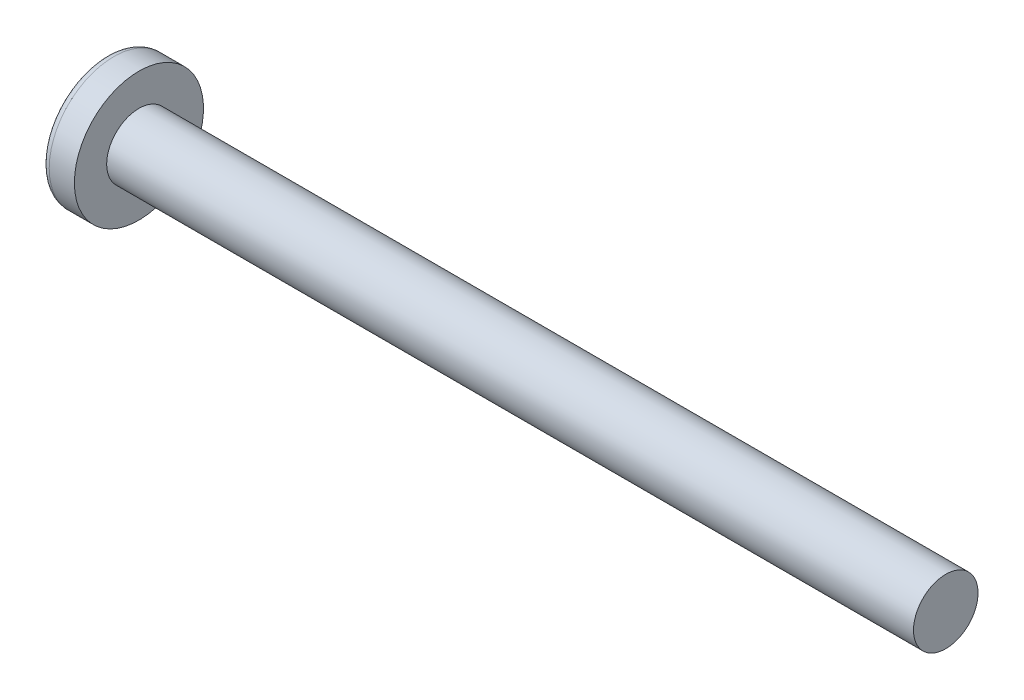
ISO-10303-21;
HEADER;
FILE_DESCRIPTION(('STEP AP214'),'2;1');
FILE_NAME('part.step','',(''),(''),'','','');
FILE_SCHEMA(('AUTOMOTIVE_DESIGN { 1 0 10303 214 1 1 1 1 }'));
ENDSEC;
DATA;
#1=APPLICATION_CONTEXT('core data for automotive mechanical design processes');
#2=APPLICATION_PROTOCOL_DEFINITION('international standard','automotive_design',2000,#1);
#3=PRODUCT_CONTEXT('',#1,'mechanical');
#4=PRODUCT('Part','Part','',(#3));
#5=PRODUCT_RELATED_PRODUCT_CATEGORY('part','',(#4));
#6=PRODUCT_DEFINITION_FORMATION('','',#4);
#7=PRODUCT_DEFINITION_CONTEXT('part definition',#1,'design');
#8=PRODUCT_DEFINITION('design','',#6,#7);
#9=PRODUCT_DEFINITION_SHAPE('','',#8);
#10=(LENGTH_UNIT() NAMED_UNIT(*) SI_UNIT(.MILLI.,.METRE.));
#11=(NAMED_UNIT(*) PLANE_ANGLE_UNIT() SI_UNIT($,.RADIAN.));
#12=(NAMED_UNIT(*) SI_UNIT($,.STERADIAN.) SOLID_ANGLE_UNIT());
#13=UNCERTAINTY_MEASURE_WITH_UNIT(LENGTH_MEASURE(1.E-05),#10,'distance_accuracy_value','');
#14=(GEOMETRIC_REPRESENTATION_CONTEXT(3) GLOBAL_UNCERTAINTY_ASSIGNED_CONTEXT((#13)) GLOBAL_UNIT_ASSIGNED_CONTEXT((#10,
#11,#12)) REPRESENTATION_CONTEXT('',''));
#15=CARTESIAN_POINT('',(0.,0.,0.));
#16=DIRECTION('',(0.,0.,1.));
#17=DIRECTION('',(1.,0.,0.));
#18=AXIS2_PLACEMENT_3D('',#15,#16,#17);
#19=CARTESIAN_POINT('',(3.2,0.,0.));
#20=DIRECTION('',(-1.,0.,0.));
#21=DIRECTION('',(0.,1.,0.));
#22=AXIS2_PLACEMENT_3D('',#19,#20,#21);
#23=SPHERICAL_SURFACE('',#22,3.2);
#24=CARTESIAN_POINT('',(0.627117875780583,0.,0.));
#25=DIRECTION('',(-1.,0.,0.));
#26=DIRECTION('',(0.,0.,1.));
#27=AXIS2_PLACEMENT_3D('',#24,#25,#26);
#28=CIRCLE('',#27,1.9027027027027);
#29=CARTESIAN_POINT('',(0.627117875780583,0.,1.9027027027027));
#30=VERTEX_POINT('',#29);
#31=EDGE_CURVE('E153',#30,#30,#28,.T.);
#32=ORIENTED_EDGE('',*,*,#31,.T.);
#33=EDGE_LOOP('',(#32));
#34=FACE_BOUND('',#33,.T.);
#35=CARTESIAN_POINT('',(3.19174554351625,-0.0818566934638239,0.));
#36=DIRECTION('',(-0.100331502261418,-0.994954064092392,0.));
#37=DIRECTION('',(0.994954064092392,-0.100331502261418,0.));
#38=AXIS2_PLACEMENT_3D('',#35,#36,#37);
#39=CIRCLE('',#38,3.1989422229361);
#40=CARTESIAN_POINT('',(0.118330716626357,0.228067490760364,0.831444314172419));
#41=VERTEX_POINT('',#40);
#42=CARTESIAN_POINT('',(0.0177814447975952,0.238206913129653,0.238206913129654));
#43=VERTEX_POINT('',#42);
#44=EDGE_CURVE('E184',#41,#43,#39,.T.);
#45=ORIENTED_EDGE('',*,*,#44,.F.);
#46=CARTESIAN_POINT('',(2.64043280070581,0.,-0.842892363493775));
#47=DIRECTION('',(0.553083521918191,0.,0.833125811497021));
#48=DIRECTION('',(0.833125811497021,0.,-0.553083521918191));
#49=AXIS2_PLACEMENT_3D('',#46,#47,#48);
#50=CIRCLE('',#49,3.03585523585001);
#51=CARTESIAN_POINT('',(0.118330716626355,-0.22806749076037,0.831444314172418));
#52=VERTEX_POINT('',#51);
#53=EDGE_CURVE('E149',#41,#52,#50,.T.);
#54=ORIENTED_EDGE('',*,*,#53,.T.);
#55=CARTESIAN_POINT('',(3.19174554351625,0.081856693463823,0.));
#56=DIRECTION('',(-0.100331502261417,0.994954064092392,0.));
#57=DIRECTION('',(-0.994954064092392,-0.100331502261417,0.));
#58=AXIS2_PLACEMENT_3D('',#55,#56,#57);
#59=CIRCLE('',#58,3.1989422229361);
#60=CARTESIAN_POINT('',(0.0177814447975943,-0.238206913129655,0.238206913129654));
#61=VERTEX_POINT('',#60);
#62=EDGE_CURVE('E105',#61,#52,#59,.T.);
#63=ORIENTED_EDGE('',*,*,#62,.F.);
#64=CARTESIAN_POINT('',(3.19174554351625,0.,-0.081856693463823));
#65=DIRECTION('',(-0.100331502261417,0.,-0.994954064092392));
#66=DIRECTION('',(-0.994954064092392,0.,0.100331502261417));
#67=AXIS2_PLACEMENT_3D('',#64,#65,#66);
#68=CIRCLE('',#67,3.1989422229361);
#69=CARTESIAN_POINT('',(0.118330716626355,-0.831444314172419,0.228067490760367));
#70=VERTEX_POINT('',#69);
#71=EDGE_CURVE('E130',#70,#61,#68,.T.);
#72=ORIENTED_EDGE('',*,*,#71,.F.);
#73=CARTESIAN_POINT('',(2.64043280070581,0.842892363493772,0.));
#74=DIRECTION('',(0.55308352191819,-0.833125811497022,0.));
#75=DIRECTION('',(0.833125811497022,0.55308352191819,0.));
#76=AXIS2_PLACEMENT_3D('',#73,#74,#75);
#77=CIRCLE('',#76,3.03585523585001);
#78=CARTESIAN_POINT('',(0.118330716626355,-0.831444314172419,-0.228067490760368));
#79=VERTEX_POINT('',#78);
#80=EDGE_CURVE('E138',#70,#79,#77,.T.);
#81=ORIENTED_EDGE('',*,*,#80,.T.);
#82=CARTESIAN_POINT('',(3.19174554351625,0.,0.0818566934638239));
#83=DIRECTION('',(-0.100331502261418,0.,0.994954064092392));
#84=DIRECTION('',(0.994954064092392,0.,0.100331502261418));
#85=AXIS2_PLACEMENT_3D('',#82,#83,#84);
#86=CIRCLE('',#85,3.1989422229361);
#87=CARTESIAN_POINT('',(0.0177814447975943,-0.238206913129653,-0.238206913129654));
#88=VERTEX_POINT('',#87);
#89=EDGE_CURVE('E48',#88,#79,#86,.T.);
#90=ORIENTED_EDGE('',*,*,#89,.F.);
#91=CARTESIAN_POINT('',(0.118330716626356,-0.228067490760364,-0.831444314172419));
#92=VERTEX_POINT('',#91);
#93=EDGE_CURVE('E191',#92,#88,#59,.T.);
#94=ORIENTED_EDGE('',*,*,#93,.F.);
#95=CARTESIAN_POINT('',(2.64043280070581,0.,0.842892363493774));
#96=DIRECTION('',(0.55308352191819,0.,-0.833125811497022));
#97=DIRECTION('',(-0.833125811497022,0.,-0.55308352191819));
#98=AXIS2_PLACEMENT_3D('',#95,#96,#97);
#99=CIRCLE('',#98,3.03585523585001);
#100=CARTESIAN_POINT('',(0.118330716626357,0.22806749076037,-0.831444314172417));
#101=VERTEX_POINT('',#100);
#102=EDGE_CURVE('E131',#92,#101,#99,.T.);
#103=ORIENTED_EDGE('',*,*,#102,.T.);
#104=CARTESIAN_POINT('',(0.0177814447975956,0.238206913129655,-0.238206913129654));
#105=VERTEX_POINT('',#104);
#106=EDGE_CURVE('E179',#105,#101,#39,.T.);
#107=ORIENTED_EDGE('',*,*,#106,.F.);
#108=CARTESIAN_POINT('',(0.118330716626357,0.831444314172418,-0.228067490760367));
#109=VERTEX_POINT('',#108);
#110=EDGE_CURVE('E41',#109,#105,#86,.T.);
#111=ORIENTED_EDGE('',*,*,#110,.F.);
#112=CARTESIAN_POINT('',(2.64043280070582,-0.842892363493777,0.));
#113=DIRECTION('',(0.553083521918191,0.833125811497021,0.));
#114=DIRECTION('',(-0.833125811497021,0.553083521918191,0.));
#115=AXIS2_PLACEMENT_3D('',#112,#113,#114);
#116=CIRCLE('',#115,3.03585523585001);
#117=CARTESIAN_POINT('',(0.118330716626358,0.831444314172418,0.228067490760367));
#118=VERTEX_POINT('',#117);
#119=EDGE_CURVE('E11',#109,#118,#116,.T.);
#120=ORIENTED_EDGE('',*,*,#119,.T.);
#121=EDGE_CURVE('E167',#43,#118,#68,.T.);
#122=ORIENTED_EDGE('',*,*,#121,.F.);
#123=EDGE_LOOP('',(#45,#54,#63,#72,#81,#90,#94,#103,#107,#111,#120,#122));
#124=FACE_BOUND('',#123,.T.);
#125=ADVANCED_FACE('F33',(#34,#124),#23,.T.);
#126=CARTESIAN_POINT('',(1.37075949367089,0.,-0.101772151898734));
#127=DIRECTION('',(-0.100331502261418,0.,0.994954064092392));
#128=DIRECTION('',(0.994954064092392,0.,0.100331502261418));
#129=AXIS2_PLACEMENT_3D('',#126,#127,#128);
#130=PLANE('',#129);
#131=ORIENTED_EDGE('',*,*,#110,.T.);
#132=DIRECTION('',(0.989983749746913,-0.0998302940921261,0.0998302940921257));
#133=VECTOR('',#132,1.);
#134=CARTESIAN_POINT('',(1.38081767298512,0.100757881715786,-0.100757881715786));
#135=LINE('',#134,#133);
#136=CARTESIAN_POINT('',(1.19,0.12,-0.12));
#137=VERTEX_POINT('',#136);
#138=EDGE_CURVE('E173',#105,#137,#135,.T.);
#139=ORIENTED_EDGE('',*,*,#138,.T.);
#140=DIRECTION('',(0.830201128729582,-0.551141925795269,0.083717760880294));
#141=VECTOR('',#140,1.);
#142=CARTESIAN_POINT('',(0.,0.91,-0.24));
#143=LINE('',#142,#141);
#144=EDGE_CURVE('E154',#109,#137,#143,.T.);
#145=ORIENTED_EDGE('',*,*,#144,.F.);
#146=EDGE_LOOP('',(#131,#139,#145));
#147=FACE_BOUND('',#146,.T.);
#148=ADVANCED_FACE('F172',(#147),#130,.T.);
#149=DIRECTION('',(0.830201128729583,0.551141925795268,0.0837177608802941));
#150=VECTOR('',#149,1.);
#151=CARTESIAN_POINT('',(0.,-0.909999999999998,-0.24));
#152=LINE('',#151,#150);
#153=CARTESIAN_POINT('',(1.19,-0.12,-0.12));
#154=VERTEX_POINT('',#153);
#155=EDGE_CURVE('E139',#79,#154,#152,.T.);
#156=ORIENTED_EDGE('',*,*,#155,.T.);
#157=DIRECTION('',(-0.989983749746913,-0.0998302940921249,-0.0998302940921257));
#158=VECTOR('',#157,1.);
#159=CARTESIAN_POINT('',(1.38081767298512,-0.100757881715786,-0.100757881715786));
#160=LINE('',#159,#158);
#161=EDGE_CURVE('E194',#154,#88,#160,.T.);
#162=ORIENTED_EDGE('',*,*,#161,.T.);
#163=ORIENTED_EDGE('',*,*,#89,.T.);
#164=EDGE_LOOP('',(#156,#162,#163));
#165=FACE_BOUND('',#164,.T.);
#166=ADVANCED_FACE('F209',(#165),#130,.T.);
#167=CARTESIAN_POINT('',(1.37075949367089,0.,0.101772151898734));
#168=DIRECTION('',(-0.100331502261417,0.,-0.994954064092392));
#169=DIRECTION('',(-0.994954064092392,0.,0.100331502261417));
#170=AXIS2_PLACEMENT_3D('',#167,#168,#169);
#171=PLANE('',#170);
#172=DIRECTION('',(0.830201128729582,-0.551141925795269,-0.0837177608802937));
#173=VECTOR('',#172,1.);
#174=CARTESIAN_POINT('',(0.,0.91,0.239999999999999));
#175=LINE('',#174,#173);
#176=CARTESIAN_POINT('',(1.19,0.12,0.12));
#177=VERTEX_POINT('',#176);
#178=EDGE_CURVE('E210',#118,#177,#175,.T.);
#179=ORIENTED_EDGE('',*,*,#178,.T.);
#180=DIRECTION('',(-0.989983749746913,0.0998302940921254,0.0998302940921253));
#181=VECTOR('',#180,1.);
#182=CARTESIAN_POINT('',(1.38081767298512,0.100757881715786,0.100757881715786));
#183=LINE('',#182,#181);
#184=EDGE_CURVE('E188',#177,#43,#183,.T.);
#185=ORIENTED_EDGE('',*,*,#184,.T.);
#186=ORIENTED_EDGE('',*,*,#121,.T.);
#187=EDGE_LOOP('',(#179,#185,#186));
#188=FACE_BOUND('',#187,.T.);
#189=ADVANCED_FACE('F214',(#188),#171,.T.);
#190=ORIENTED_EDGE('',*,*,#71,.T.);
#191=DIRECTION('',(0.989983749746913,0.0998302940921256,-0.0998302940921253));
#192=VECTOR('',#191,1.);
#193=CARTESIAN_POINT('',(1.38081767298512,-0.100757881715786,0.100757881715786));
#194=LINE('',#193,#192);
#195=CARTESIAN_POINT('',(1.19,-0.12,0.12));
#196=VERTEX_POINT('',#195);
#197=EDGE_CURVE('E103',#61,#196,#194,.T.);
#198=ORIENTED_EDGE('',*,*,#197,.T.);
#199=DIRECTION('',(0.830201128729583,0.551141925795268,-0.0837177608802937));
#200=VECTOR('',#199,1.);
#201=CARTESIAN_POINT('',(0.,-0.909999999999998,0.239999999999999));
#202=LINE('',#201,#200);
#203=EDGE_CURVE('E128',#70,#196,#202,.T.);
#204=ORIENTED_EDGE('',*,*,#203,.F.);
#205=EDGE_LOOP('',(#190,#198,#204));
#206=FACE_BOUND('',#205,.T.);
#207=ADVANCED_FACE('F127',(#206),#171,.T.);
#208=CARTESIAN_POINT('',(-25.4,0.,0.));
#209=DIRECTION('',(-1.,0.,0.));
#210=DIRECTION('',(0.,0.,1.));
#211=AXIS2_PLACEMENT_3D('',#208,#209,#210);
#212=CYLINDRICAL_SURFACE('',#211,1.);
#213=CARTESIAN_POINT('',(26.6,0.,0.));
#214=DIRECTION('',(-1.,0.,0.));
#215=DIRECTION('',(0.,0.,1.));
#216=AXIS2_PLACEMENT_3D('',#213,#214,#215);
#217=CIRCLE('',#216,1.);
#218=CARTESIAN_POINT('',(26.6,0.,1.));
#219=VERTEX_POINT('',#218);
#220=EDGE_CURVE('E150',#219,#219,#217,.T.);
#221=ORIENTED_EDGE('',*,*,#220,.T.);
#222=EDGE_LOOP('',(#221));
#223=FACE_BOUND('',#222,.T.);
#224=CARTESIAN_POINT('',(1.6,0.,0.));
#225=DIRECTION('',(-1.,0.,0.));
#226=DIRECTION('',(0.,0.,1.));
#227=AXIS2_PLACEMENT_3D('',#224,#225,#226);
#228=CIRCLE('',#227,1.);
#229=CARTESIAN_POINT('',(1.6,0.,1.));
#230=VERTEX_POINT('',#229);
#231=EDGE_CURVE('E163',#230,#230,#228,.T.);
#232=ORIENTED_EDGE('',*,*,#231,.F.);
#233=EDGE_LOOP('',(#232));
#234=FACE_BOUND('',#233,.T.);
#235=ADVANCED_FACE('F35',(#223,#234),#212,.T.);
#236=CARTESIAN_POINT('',(1.6,1.,0.));
#237=DIRECTION('',(-1.,0.,0.));
#238=DIRECTION('',(0.,0.,1.));
#239=AXIS2_PLACEMENT_3D('',#236,#237,#238);
#240=PLANE('',#239);
#241=CARTESIAN_POINT('',(1.6,0.,0.));
#242=DIRECTION('',(-1.,0.,0.));
#243=DIRECTION('',(0.,0.,1.));
#244=AXIS2_PLACEMENT_3D('',#241,#242,#243);
#245=CIRCLE('',#244,2.);
#246=CARTESIAN_POINT('',(1.6,0.,2.));
#247=VERTEX_POINT('',#246);
#248=EDGE_CURVE('E160',#247,#247,#245,.T.);
#249=ORIENTED_EDGE('',*,*,#248,.F.);
#250=EDGE_LOOP('',(#249));
#251=FACE_BOUND('',#250,.T.);
#252=ORIENTED_EDGE('',*,*,#231,.T.);
#253=EDGE_LOOP('',(#252));
#254=FACE_BOUND('',#253,.T.);
#255=ADVANCED_FACE('F242',(#251,#254),#240,.F.);
#256=CARTESIAN_POINT('',(-25.4,0.,0.));
#257=DIRECTION('',(-1.,0.,0.));
#258=DIRECTION('',(0.,0.,1.));
#259=AXIS2_PLACEMENT_3D('',#256,#257,#258);
#260=CYLINDRICAL_SURFACE('',#259,2.);
#261=ORIENTED_EDGE('',*,*,#248,.T.);
#262=EDGE_LOOP('',(#261));
#263=FACE_BOUND('',#262,.T.);
#264=CARTESIAN_POINT('',(0.820084035097042,0.,0.));
#265=DIRECTION('',(-1.,0.,0.));
#266=DIRECTION('',(0.,0.,1.));
#267=AXIS2_PLACEMENT_3D('',#264,#265,#266);
#268=CIRCLE('',#267,2.);
#269=CARTESIAN_POINT('',(0.820084035097042,0.,2.));
#270=VERTEX_POINT('',#269);
#271=EDGE_CURVE('E157',#270,#270,#268,.T.);
#272=ORIENTED_EDGE('',*,*,#271,.F.);
#273=EDGE_LOOP('',(#272));
#274=FACE_BOUND('',#273,.T.);
#275=ADVANCED_FACE('F239',(#263,#274),#260,.T.);
#276=CARTESIAN_POINT('',(0.820084035097042,0.,0.));
#277=DIRECTION('',(-1.,0.,0.));
#278=DIRECTION('',(0.,0.,1.));
#279=AXIS2_PLACEMENT_3D('',#276,#277,#278);
#280=TOROIDAL_SURFACE('',#279,1.76,0.24);
#281=ORIENTED_EDGE('',*,*,#271,.T.);
#282=EDGE_LOOP('',(#281));
#283=FACE_BOUND('',#282,.T.);
#284=ORIENTED_EDGE('',*,*,#31,.F.);
#285=EDGE_LOOP('',(#284));
#286=FACE_BOUND('',#285,.T.);
#287=ADVANCED_FACE('F236',(#283,#286),#280,.T.);
#288=CARTESIAN_POINT('',(26.6,1.,0.));
#289=DIRECTION('',(1.,0.,0.));
#290=DIRECTION('',(0.,0.,-1.));
#291=AXIS2_PLACEMENT_3D('',#288,#289,#290);
#292=PLANE('',#291);
#293=ORIENTED_EDGE('',*,*,#220,.F.);
#294=EDGE_LOOP('',(#293));
#295=FACE_BOUND('',#294,.T.);
#296=ADVANCED_FACE('F234',(#295),#292,.T.);
#297=CARTESIAN_POINT('',(1.19,0.12,0.12));
#298=DIRECTION('',(0.553083521918191,0.833125811497021,0.));
#299=DIRECTION('',(-0.833125811497021,0.553083521918191,0.));
#300=AXIS2_PLACEMENT_3D('',#297,#298,#299);
#301=PLANE('',#300);
#302=ORIENTED_EDGE('',*,*,#144,.T.);
#303=DIRECTION('',(0.,0.,-1.));
#304=VECTOR('',#303,1.);
#305=CARTESIAN_POINT('',(1.19,0.12,0.12));
#306=LINE('',#305,#304);
#307=EDGE_CURVE('E121',#177,#137,#306,.T.);
#308=ORIENTED_EDGE('',*,*,#307,.F.);
#309=ORIENTED_EDGE('',*,*,#178,.F.);
#310=ORIENTED_EDGE('',*,*,#119,.F.);
#311=EDGE_LOOP('',(#302,#308,#309,#310));
#312=FACE_BOUND('',#311,.T.);
#313=ADVANCED_FACE('F213',(#312),#301,.F.);
#314=CARTESIAN_POINT('',(0.,-0.909999999999998,-0.24));
#315=DIRECTION('',(0.55308352191819,-0.833125811497022,0.));
#316=DIRECTION('',(0.833125811497022,0.55308352191819,0.));
#317=AXIS2_PLACEMENT_3D('',#314,#315,#316);
#318=PLANE('',#317);
#319=ORIENTED_EDGE('',*,*,#203,.T.);
#320=DIRECTION('',(0.,0.,1.));
#321=VECTOR('',#320,1.);
#322=CARTESIAN_POINT('',(1.19,-0.12,-0.12));
#323=LINE('',#322,#321);
#324=EDGE_CURVE('E120',#154,#196,#323,.T.);
#325=ORIENTED_EDGE('',*,*,#324,.F.);
#326=ORIENTED_EDGE('',*,*,#155,.F.);
#327=ORIENTED_EDGE('',*,*,#80,.F.);
#328=EDGE_LOOP('',(#319,#325,#326,#327));
#329=FACE_BOUND('',#328,.T.);
#330=ADVANCED_FACE('F135',(#329),#318,.F.);
#331=CARTESIAN_POINT('',(1.19,0.12,-0.12));
#332=DIRECTION('',(-1.,0.,0.));
#333=DIRECTION('',(0.,0.,1.));
#334=AXIS2_PLACEMENT_3D('',#331,#332,#333);
#335=PLANE('',#334);
#336=DIRECTION('',(0.,1.,0.));
#337=VECTOR('',#336,1.);
#338=CARTESIAN_POINT('',(1.19,-0.12,-0.12));
#339=LINE('',#338,#337);
#340=EDGE_CURVE('E143',#154,#137,#339,.T.);
#341=ORIENTED_EDGE('',*,*,#340,.F.);
#342=ORIENTED_EDGE('',*,*,#324,.T.);
#343=DIRECTION('',(0.,-1.,0.));
#344=VECTOR('',#343,1.);
#345=CARTESIAN_POINT('',(1.19,0.12,0.12));
#346=LINE('',#345,#344);
#347=EDGE_CURVE('E112',#177,#196,#346,.T.);
#348=ORIENTED_EDGE('',*,*,#347,.F.);
#349=ORIENTED_EDGE('',*,*,#307,.T.);
#350=EDGE_LOOP('',(#341,#342,#348,#349));
#351=FACE_BOUND('',#350,.T.);
#352=ADVANCED_FACE('F141',(#351),#335,.T.);
#353=CARTESIAN_POINT('',(0.,0.240000000000003,-0.909999999999998));
#354=DIRECTION('',(0.55308352191819,0.,-0.833125811497022));
#355=DIRECTION('',(0.833125811497022,0.,0.55308352191819));
#356=AXIS2_PLACEMENT_3D('',#353,#354,#355);
#357=PLANE('',#356);
#358=DIRECTION('',(0.830201128729583,0.0837177608802917,0.551141925795268));
#359=VECTOR('',#358,1.);
#360=CARTESIAN_POINT('',(0.,-0.239999999999996,-0.909999999999999));
#361=LINE('',#360,#359);
#362=EDGE_CURVE('E199',#92,#154,#361,.T.);
#363=ORIENTED_EDGE('',*,*,#362,.T.);
#364=ORIENTED_EDGE('',*,*,#340,.T.);
#365=DIRECTION('',(0.830201128729583,-0.083717760880296,0.551141925795268));
#366=VECTOR('',#365,1.);
#367=CARTESIAN_POINT('',(0.,0.240000000000003,-0.909999999999998));
#368=LINE('',#367,#366);
#369=EDGE_CURVE('E109',#101,#137,#368,.T.);
#370=ORIENTED_EDGE('',*,*,#369,.F.);
#371=ORIENTED_EDGE('',*,*,#102,.F.);
#372=EDGE_LOOP('',(#363,#364,#370,#371));
#373=FACE_BOUND('',#372,.T.);
#374=ADVANCED_FACE('F204',(#373),#357,.F.);
#375=CARTESIAN_POINT('',(1.37075949367089,-0.101772151898734,0.));
#376=DIRECTION('',(-0.100331502261417,0.994954064092392,0.));
#377=DIRECTION('',(-0.994954064092392,-0.100331502261417,0.));
#378=AXIS2_PLACEMENT_3D('',#375,#376,#377);
#379=PLANE('',#378);
#380=ORIENTED_EDGE('',*,*,#93,.T.);
#381=ORIENTED_EDGE('',*,*,#161,.F.);
#382=ORIENTED_EDGE('',*,*,#362,.F.);
#383=EDGE_LOOP('',(#380,#381,#382));
#384=FACE_BOUND('',#383,.T.);
#385=ADVANCED_FACE('F208',(#384),#379,.T.);
#386=CARTESIAN_POINT('',(1.37075949367089,0.101772151898734,0.));
#387=DIRECTION('',(-0.100331502261418,-0.994954064092392,0.));
#388=DIRECTION('',(0.994954064092392,-0.100331502261418,0.));
#389=AXIS2_PLACEMENT_3D('',#386,#387,#388);
#390=PLANE('',#389);
#391=ORIENTED_EDGE('',*,*,#106,.T.);
#392=ORIENTED_EDGE('',*,*,#369,.T.);
#393=ORIENTED_EDGE('',*,*,#138,.F.);
#394=EDGE_LOOP('',(#391,#392,#393));
#395=FACE_BOUND('',#394,.T.);
#396=ADVANCED_FACE('F202',(#395),#390,.T.);
#397=CARTESIAN_POINT('',(1.19,-0.12,0.12));
#398=DIRECTION('',(0.553083521918191,0.,0.833125811497021));
#399=DIRECTION('',(-0.833125811497021,0.,0.553083521918191));
#400=AXIS2_PLACEMENT_3D('',#397,#398,#399);
#401=PLANE('',#400);
#402=DIRECTION('',(0.830201128729582,-0.0837177608802921,-0.551141925795269));
#403=VECTOR('',#402,1.);
#404=CARTESIAN_POINT('',(0.,0.239999999999997,0.910000000000001));
#405=LINE('',#404,#403);
#406=EDGE_CURVE('E108',#41,#177,#405,.T.);
#407=ORIENTED_EDGE('',*,*,#406,.T.);
#408=ORIENTED_EDGE('',*,*,#347,.T.);
#409=DIRECTION('',(0.830201128729582,0.0837177608802956,-0.551141925795269));
#410=VECTOR('',#409,1.);
#411=CARTESIAN_POINT('',(0.,-0.240000000000003,0.909999999999999));
#412=LINE('',#411,#410);
#413=EDGE_CURVE('E99',#52,#196,#412,.T.);
#414=ORIENTED_EDGE('',*,*,#413,.F.);
#415=ORIENTED_EDGE('',*,*,#53,.F.);
#416=EDGE_LOOP('',(#407,#408,#414,#415));
#417=FACE_BOUND('',#416,.T.);
#418=ADVANCED_FACE('F113',(#417),#401,.F.);
#419=ORIENTED_EDGE('',*,*,#44,.T.);
#420=ORIENTED_EDGE('',*,*,#184,.F.);
#421=ORIENTED_EDGE('',*,*,#406,.F.);
#422=EDGE_LOOP('',(#419,#420,#421));
#423=FACE_BOUND('',#422,.T.);
#424=ADVANCED_FACE('F215',(#423),#390,.T.);
#425=ORIENTED_EDGE('',*,*,#62,.T.);
#426=ORIENTED_EDGE('',*,*,#413,.T.);
#427=ORIENTED_EDGE('',*,*,#197,.F.);
#428=EDGE_LOOP('',(#425,#426,#427));
#429=FACE_BOUND('',#428,.T.);
#430=ADVANCED_FACE('F101',(#429),#379,.T.);
#431=CLOSED_SHELL('',(#125,#148,#166,#189,#207,#235,#255,#275,#287,#296,#313,#330,#352,#374,
#385,#396,#418,#424,#430));
#432=MANIFOLD_SOLID_BREP('B2',#431);
#433=ADVANCED_BREP_SHAPE_REPRESENTATION('',(#18,#432),#14);
#434=SHAPE_DEFINITION_REPRESENTATION(#9,#433);
ENDSEC;
END-ISO-10303-21;
